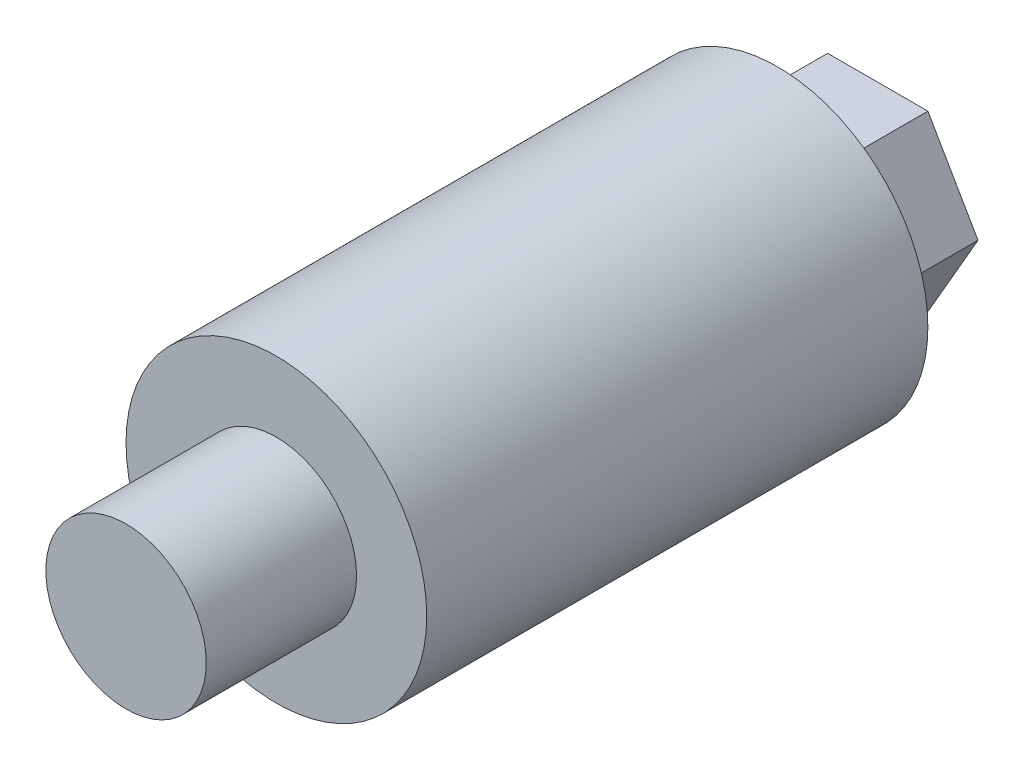
ISO-10303-21;
HEADER;
FILE_DESCRIPTION(('STEP AP214'),'2;1');
FILE_NAME('part.step','',(''),(''),'','','');
FILE_SCHEMA(('AUTOMOTIVE_DESIGN { 1 0 10303 214 1 1 1 1 }'));
ENDSEC;
DATA;
#1=APPLICATION_CONTEXT('core data for automotive mechanical design processes');
#2=APPLICATION_PROTOCOL_DEFINITION('international standard','automotive_design',2000,#1);
#3=PRODUCT_CONTEXT('',#1,'mechanical');
#4=PRODUCT('Part','Part','',(#3));
#5=PRODUCT_RELATED_PRODUCT_CATEGORY('part','',(#4));
#6=PRODUCT_DEFINITION_FORMATION('','',#4);
#7=PRODUCT_DEFINITION_CONTEXT('part definition',#1,'design');
#8=PRODUCT_DEFINITION('design','',#6,#7);
#9=PRODUCT_DEFINITION_SHAPE('','',#8);
#10=(LENGTH_UNIT() NAMED_UNIT(*) SI_UNIT(.MILLI.,.METRE.));
#11=(NAMED_UNIT(*) PLANE_ANGLE_UNIT() SI_UNIT($,.RADIAN.));
#12=(NAMED_UNIT(*) SI_UNIT($,.STERADIAN.) SOLID_ANGLE_UNIT());
#13=UNCERTAINTY_MEASURE_WITH_UNIT(LENGTH_MEASURE(1.E-05),#10,'distance_accuracy_value','');
#14=(GEOMETRIC_REPRESENTATION_CONTEXT(3) GLOBAL_UNCERTAINTY_ASSIGNED_CONTEXT((#13)) GLOBAL_UNIT_ASSIGNED_CONTEXT((#10,
#11,#12)) REPRESENTATION_CONTEXT('',''));
#15=CARTESIAN_POINT('',(0.,0.,0.));
#16=DIRECTION('',(0.,0.,1.));
#17=DIRECTION('',(1.,0.,0.));
#18=AXIS2_PLACEMENT_3D('',#15,#16,#17);
#19=CARTESIAN_POINT('',(0.,0.,0.));
#20=DIRECTION('',(0.,0.,1.));
#21=DIRECTION('',(1.,0.,0.));
#22=AXIS2_PLACEMENT_3D('',#19,#20,#21);
#23=PLANE('',#22);
#24=CARTESIAN_POINT('',(0.,0.,0.));
#25=DIRECTION('',(0.,0.,1.));
#26=DIRECTION('',(1.,0.,0.));
#27=AXIS2_PLACEMENT_3D('',#24,#25,#26);
#28=CIRCLE('',#27,15.);
#29=CARTESIAN_POINT('',(15.,0.,0.));
#30=VERTEX_POINT('',#29);
#31=EDGE_CURVE('E40',#30,#30,#28,.T.);
#32=ORIENTED_EDGE('',*,*,#31,.F.);
#33=EDGE_LOOP('',(#32));
#34=FACE_BOUND('',#33,.T.);
#35=DIRECTION('',(-0.5,0.866025403784439,0.));
#36=VECTOR('',#35,1.);
#37=CARTESIAN_POINT('',(-5.,-8.66025403784439,0.));
#38=LINE('',#37,#36);
#39=CARTESIAN_POINT('',(-5.,-8.66025403784439,0.));
#40=VERTEX_POINT('',#39);
#41=CARTESIAN_POINT('',(-10.,0.,0.));
#42=VERTEX_POINT('',#41);
#43=EDGE_CURVE('E53',#40,#42,#38,.T.);
#44=ORIENTED_EDGE('',*,*,#43,.F.);
#45=DIRECTION('',(-1.,0.,0.));
#46=VECTOR('',#45,1.);
#47=CARTESIAN_POINT('',(5.,-8.66025403784439,0.));
#48=LINE('',#47,#46);
#49=CARTESIAN_POINT('',(5.,-8.66025403784439,0.));
#50=VERTEX_POINT('',#49);
#51=EDGE_CURVE('E57',#50,#40,#48,.T.);
#52=ORIENTED_EDGE('',*,*,#51,.F.);
#53=DIRECTION('',(-0.5,-0.866025403784439,0.));
#54=VECTOR('',#53,1.);
#55=CARTESIAN_POINT('',(10.,0.,0.));
#56=LINE('',#55,#54);
#57=CARTESIAN_POINT('',(10.,0.,0.));
#58=VERTEX_POINT('',#57);
#59=EDGE_CURVE('E238',#58,#50,#56,.T.);
#60=ORIENTED_EDGE('',*,*,#59,.F.);
#61=DIRECTION('',(0.5,-0.866025403784439,0.));
#62=VECTOR('',#61,1.);
#63=CARTESIAN_POINT('',(5.,8.66025403784439,0.));
#64=LINE('',#63,#62);
#65=CARTESIAN_POINT('',(5.,8.66025403784439,0.));
#66=VERTEX_POINT('',#65);
#67=EDGE_CURVE('E253',#66,#58,#64,.T.);
#68=ORIENTED_EDGE('',*,*,#67,.F.);
#69=DIRECTION('',(1.,0.,0.));
#70=VECTOR('',#69,1.);
#71=CARTESIAN_POINT('',(-5.,8.66025403784439,0.));
#72=LINE('',#71,#70);
#73=CARTESIAN_POINT('',(-5.,8.66025403784439,0.));
#74=VERTEX_POINT('',#73);
#75=EDGE_CURVE('E256',#74,#66,#72,.T.);
#76=ORIENTED_EDGE('',*,*,#75,.F.);
#77=DIRECTION('',(0.5,0.866025403784439,0.));
#78=VECTOR('',#77,1.);
#79=CARTESIAN_POINT('',(-10.,0.,0.));
#80=LINE('',#79,#78);
#81=EDGE_CURVE('E257',#42,#74,#80,.T.);
#82=ORIENTED_EDGE('',*,*,#81,.F.);
#83=EDGE_LOOP('',(#44,#52,#60,#68,#76,#82));
#84=FACE_BOUND('',#83,.T.);
#85=ADVANCED_FACE('F36',(#34,#84),#23,.F.);
#86=CARTESIAN_POINT('',(0.,0.,50.));
#87=DIRECTION('',(0.,0.,-1.));
#88=DIRECTION('',(-1.,0.,0.));
#89=AXIS2_PLACEMENT_3D('',#86,#87,#88);
#90=CYLINDRICAL_SURFACE('',#89,15.);
#91=CARTESIAN_POINT('',(0.,0.,50.));
#92=DIRECTION('',(0.,0.,1.));
#93=DIRECTION('',(1.,0.,0.));
#94=AXIS2_PLACEMENT_3D('',#91,#92,#93);
#95=CIRCLE('',#94,15.);
#96=CARTESIAN_POINT('',(15.,0.,50.));
#97=VERTEX_POINT('',#96);
#98=EDGE_CURVE('E45',#97,#97,#95,.T.);
#99=ORIENTED_EDGE('',*,*,#98,.F.);
#100=EDGE_LOOP('',(#99));
#101=FACE_BOUND('',#100,.T.);
#102=ORIENTED_EDGE('',*,*,#31,.T.);
#103=EDGE_LOOP('',(#102));
#104=FACE_BOUND('',#103,.T.);
#105=ADVANCED_FACE('F38',(#101,#104),#90,.T.);
#106=CARTESIAN_POINT('',(0.,0.,50.));
#107=DIRECTION('',(0.,0.,1.));
#108=DIRECTION('',(1.,0.,0.));
#109=AXIS2_PLACEMENT_3D('',#106,#107,#108);
#110=PLANE('',#109);
#111=CARTESIAN_POINT('',(0.,0.,50.));
#112=DIRECTION('',(0.,0.,1.));
#113=DIRECTION('',(1.,0.,0.));
#114=AXIS2_PLACEMENT_3D('',#111,#112,#113);
#115=CIRCLE('',#114,8.);
#116=CARTESIAN_POINT('',(8.,0.,50.));
#117=VERTEX_POINT('',#116);
#118=EDGE_CURVE('E11',#117,#117,#115,.T.);
#119=ORIENTED_EDGE('',*,*,#118,.F.);
#120=EDGE_LOOP('',(#119));
#121=FACE_BOUND('',#120,.T.);
#122=ORIENTED_EDGE('',*,*,#98,.T.);
#123=EDGE_LOOP('',(#122));
#124=FACE_BOUND('',#123,.T.);
#125=ADVANCED_FACE('F129',(#121,#124),#110,.T.);
#126=CARTESIAN_POINT('',(0.,0.,65.));
#127=DIRECTION('',(0.,0.,-1.));
#128=DIRECTION('',(-1.,0.,0.));
#129=AXIS2_PLACEMENT_3D('',#126,#127,#128);
#130=CYLINDRICAL_SURFACE('',#129,8.);
#131=CARTESIAN_POINT('',(0.,0.,65.));
#132=DIRECTION('',(0.,0.,1.));
#133=DIRECTION('',(1.,0.,0.));
#134=AXIS2_PLACEMENT_3D('',#131,#132,#133);
#135=CIRCLE('',#134,8.);
#136=CARTESIAN_POINT('',(8.,0.,65.));
#137=VERTEX_POINT('',#136);
#138=EDGE_CURVE('E111',#137,#137,#135,.T.);
#139=ORIENTED_EDGE('',*,*,#138,.F.);
#140=EDGE_LOOP('',(#139));
#141=FACE_BOUND('',#140,.T.);
#142=ORIENTED_EDGE('',*,*,#118,.T.);
#143=EDGE_LOOP('',(#142));
#144=FACE_BOUND('',#143,.T.);
#145=ADVANCED_FACE('F134',(#141,#144),#130,.T.);
#146=CARTESIAN_POINT('',(0.,0.,65.));
#147=DIRECTION('',(0.,0.,1.));
#148=DIRECTION('',(1.,0.,0.));
#149=AXIS2_PLACEMENT_3D('',#146,#147,#148);
#150=PLANE('',#149);
#151=ORIENTED_EDGE('',*,*,#138,.T.);
#152=EDGE_LOOP('',(#151));
#153=FACE_BOUND('',#152,.T.);
#154=ADVANCED_FACE('F138',(#153),#150,.T.);
#155=CARTESIAN_POINT('',(-5.,-8.66025403784439,-10.));
#156=DIRECTION('',(0.866025403784439,0.5,0.));
#157=DIRECTION('',(-0.5,0.866025403784439,0.));
#158=AXIS2_PLACEMENT_3D('',#155,#156,#157);
#159=PLANE('',#158);
#160=ORIENTED_EDGE('',*,*,#43,.T.);
#161=DIRECTION('',(0.,0.,1.));
#162=VECTOR('',#161,1.);
#163=CARTESIAN_POINT('',(-10.,0.,-10.));
#164=LINE('',#163,#162);
#165=CARTESIAN_POINT('',(-10.,0.,-10.));
#166=VERTEX_POINT('',#165);
#167=EDGE_CURVE('E94',#166,#42,#164,.T.);
#168=ORIENTED_EDGE('',*,*,#167,.F.);
#169=DIRECTION('',(-0.5,0.866025403784439,0.));
#170=VECTOR('',#169,1.);
#171=CARTESIAN_POINT('',(-5.,-8.66025403784439,-10.));
#172=LINE('',#171,#170);
#173=CARTESIAN_POINT('',(-5.,-8.66025403784439,-10.));
#174=VERTEX_POINT('',#173);
#175=EDGE_CURVE('E100',#174,#166,#172,.T.);
#176=ORIENTED_EDGE('',*,*,#175,.F.);
#177=DIRECTION('',(0.,0.,1.));
#178=VECTOR('',#177,1.);
#179=CARTESIAN_POINT('',(-5.,-8.66025403784439,-10.));
#180=LINE('',#179,#178);
#181=EDGE_CURVE('E235',#174,#40,#180,.T.);
#182=ORIENTED_EDGE('',*,*,#181,.T.);
#183=EDGE_LOOP('',(#160,#168,#176,#182));
#184=FACE_BOUND('',#183,.T.);
#185=ADVANCED_FACE('F110',(#184),#159,.F.);
#186=CARTESIAN_POINT('',(-10.,0.,-10.));
#187=DIRECTION('',(0.866025403784439,-0.5,0.));
#188=DIRECTION('',(0.5,0.866025403784439,0.));
#189=AXIS2_PLACEMENT_3D('',#186,#187,#188);
#190=PLANE('',#189);
#191=ORIENTED_EDGE('',*,*,#81,.T.);
#192=DIRECTION('',(0.,0.,1.));
#193=VECTOR('',#192,1.);
#194=CARTESIAN_POINT('',(-5.,8.66025403784439,-10.));
#195=LINE('',#194,#193);
#196=CARTESIAN_POINT('',(-5.,8.66025403784439,-10.));
#197=VERTEX_POINT('',#196);
#198=EDGE_CURVE('E96',#197,#74,#195,.T.);
#199=ORIENTED_EDGE('',*,*,#198,.F.);
#200=DIRECTION('',(0.5,0.866025403784439,0.));
#201=VECTOR('',#200,1.);
#202=CARTESIAN_POINT('',(-10.,0.,-10.));
#203=LINE('',#202,#201);
#204=EDGE_CURVE('E89',#166,#197,#203,.T.);
#205=ORIENTED_EDGE('',*,*,#204,.F.);
#206=ORIENTED_EDGE('',*,*,#167,.T.);
#207=EDGE_LOOP('',(#191,#199,#205,#206));
#208=FACE_BOUND('',#207,.T.);
#209=ADVANCED_FACE('F92',(#208),#190,.F.);
#210=CARTESIAN_POINT('',(-5.,8.66025403784439,-10.));
#211=DIRECTION('',(0.,-1.,0.));
#212=DIRECTION('',(0.,0.,-1.));
#213=AXIS2_PLACEMENT_3D('',#210,#211,#212);
#214=PLANE('',#213);
#215=ORIENTED_EDGE('',*,*,#75,.T.);
#216=DIRECTION('',(0.,0.,1.));
#217=VECTOR('',#216,1.);
#218=CARTESIAN_POINT('',(5.,8.66025403784439,-10.));
#219=LINE('',#218,#217);
#220=CARTESIAN_POINT('',(5.,8.66025403784439,-10.));
#221=VERTEX_POINT('',#220);
#222=EDGE_CURVE('E115',#221,#66,#219,.T.);
#223=ORIENTED_EDGE('',*,*,#222,.F.);
#224=DIRECTION('',(1.,0.,0.));
#225=VECTOR('',#224,1.);
#226=CARTESIAN_POINT('',(-5.,8.66025403784439,-10.));
#227=LINE('',#226,#225);
#228=EDGE_CURVE('E99',#197,#221,#227,.T.);
#229=ORIENTED_EDGE('',*,*,#228,.F.);
#230=ORIENTED_EDGE('',*,*,#198,.T.);
#231=EDGE_LOOP('',(#215,#223,#229,#230));
#232=FACE_BOUND('',#231,.T.);
#233=ADVANCED_FACE('F147',(#232),#214,.F.);
#234=CARTESIAN_POINT('',(5.,8.66025403784439,-10.));
#235=DIRECTION('',(-0.866025403784439,-0.5,0.));
#236=DIRECTION('',(0.5,-0.866025403784439,0.));
#237=AXIS2_PLACEMENT_3D('',#234,#235,#236);
#238=PLANE('',#237);
#239=ORIENTED_EDGE('',*,*,#67,.T.);
#240=DIRECTION('',(0.,0.,1.));
#241=VECTOR('',#240,1.);
#242=CARTESIAN_POINT('',(10.,0.,-10.));
#243=LINE('',#242,#241);
#244=CARTESIAN_POINT('',(10.,0.,-10.));
#245=VERTEX_POINT('',#244);
#246=EDGE_CURVE('E241',#245,#58,#243,.T.);
#247=ORIENTED_EDGE('',*,*,#246,.F.);
#248=DIRECTION('',(0.5,-0.866025403784439,0.));
#249=VECTOR('',#248,1.);
#250=CARTESIAN_POINT('',(5.,8.66025403784439,-10.));
#251=LINE('',#250,#249);
#252=EDGE_CURVE('E254',#221,#245,#251,.T.);
#253=ORIENTED_EDGE('',*,*,#252,.F.);
#254=ORIENTED_EDGE('',*,*,#222,.T.);
#255=EDGE_LOOP('',(#239,#247,#253,#254));
#256=FACE_BOUND('',#255,.T.);
#257=ADVANCED_FACE('F150',(#256),#238,.F.);
#258=CARTESIAN_POINT('',(10.,0.,-10.));
#259=DIRECTION('',(-0.866025403784439,0.5,0.));
#260=DIRECTION('',(-0.5,-0.866025403784439,0.));
#261=AXIS2_PLACEMENT_3D('',#258,#259,#260);
#262=PLANE('',#261);
#263=ORIENTED_EDGE('',*,*,#59,.T.);
#264=DIRECTION('',(0.,0.,1.));
#265=VECTOR('',#264,1.);
#266=CARTESIAN_POINT('',(5.,-8.66025403784439,-10.));
#267=LINE('',#266,#265);
#268=CARTESIAN_POINT('',(5.,-8.66025403784439,-10.));
#269=VERTEX_POINT('',#268);
#270=EDGE_CURVE('E237',#269,#50,#267,.T.);
#271=ORIENTED_EDGE('',*,*,#270,.F.);
#272=DIRECTION('',(-0.5,-0.866025403784439,0.));
#273=VECTOR('',#272,1.);
#274=CARTESIAN_POINT('',(10.,0.,-10.));
#275=LINE('',#274,#273);
#276=EDGE_CURVE('E243',#245,#269,#275,.T.);
#277=ORIENTED_EDGE('',*,*,#276,.F.);
#278=ORIENTED_EDGE('',*,*,#246,.T.);
#279=EDGE_LOOP('',(#263,#271,#277,#278));
#280=FACE_BOUND('',#279,.T.);
#281=ADVANCED_FACE('F154',(#280),#262,.F.);
#282=CARTESIAN_POINT('',(5.,-8.66025403784439,-10.));
#283=DIRECTION('',(0.,1.,0.));
#284=DIRECTION('',(0.,0.,1.));
#285=AXIS2_PLACEMENT_3D('',#282,#283,#284);
#286=PLANE('',#285);
#287=ORIENTED_EDGE('',*,*,#51,.T.);
#288=ORIENTED_EDGE('',*,*,#181,.F.);
#289=DIRECTION('',(-1.,0.,0.));
#290=VECTOR('',#289,1.);
#291=CARTESIAN_POINT('',(5.,-8.66025403784439,-10.));
#292=LINE('',#291,#290);
#293=EDGE_CURVE('E105',#269,#174,#292,.T.);
#294=ORIENTED_EDGE('',*,*,#293,.F.);
#295=ORIENTED_EDGE('',*,*,#270,.T.);
#296=EDGE_LOOP('',(#287,#288,#294,#295));
#297=FACE_BOUND('',#296,.T.);
#298=ADVANCED_FACE('F158',(#297),#286,.F.);
#299=CARTESIAN_POINT('',(0.,0.,-10.));
#300=DIRECTION('',(0.,0.,-1.));
#301=DIRECTION('',(-1.,0.,0.));
#302=AXIS2_PLACEMENT_3D('',#299,#300,#301);
#303=PLANE('',#302);
#304=ORIENTED_EDGE('',*,*,#175,.T.);
#305=ORIENTED_EDGE('',*,*,#204,.T.);
#306=ORIENTED_EDGE('',*,*,#228,.T.);
#307=ORIENTED_EDGE('',*,*,#252,.T.);
#308=ORIENTED_EDGE('',*,*,#276,.T.);
#309=ORIENTED_EDGE('',*,*,#293,.T.);
#310=EDGE_LOOP('',(#304,#305,#306,#307,#308,#309));
#311=FACE_BOUND('',#310,.T.);
#312=ADVANCED_FACE('F103',(#311),#303,.T.);
#313=CLOSED_SHELL('',(#85,#105,#125,#145,#154,#185,#209,#233,#257,#281,#298,#312));
#314=MANIFOLD_SOLID_BREP('B2',#313);
#315=ADVANCED_BREP_SHAPE_REPRESENTATION('',(#18,#314),#14);
#316=SHAPE_DEFINITION_REPRESENTATION(#9,#315);
ENDSEC;
END-ISO-10303-21;
